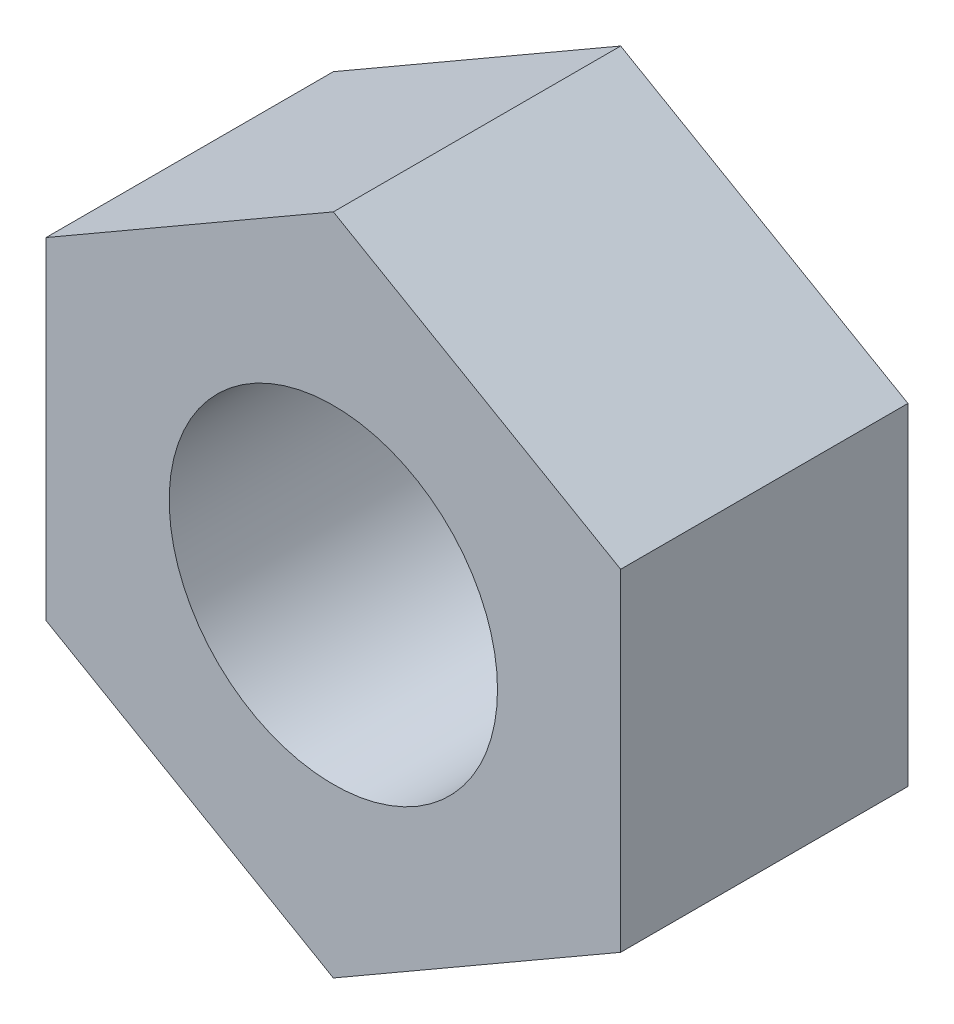
ISO-10303-21;
HEADER;
FILE_DESCRIPTION(('STEP AP214'),'2;1');
FILE_NAME('part.step','',(''),(''),'','','');
FILE_SCHEMA(('AUTOMOTIVE_DESIGN { 1 0 10303 214 1 1 1 1 }'));
ENDSEC;
DATA;
#1=APPLICATION_CONTEXT('core data for automotive mechanical design processes');
#2=APPLICATION_PROTOCOL_DEFINITION('international standard','automotive_design',2000,#1);
#3=PRODUCT_CONTEXT('',#1,'mechanical');
#4=PRODUCT('Part','Part','',(#3));
#5=PRODUCT_RELATED_PRODUCT_CATEGORY('part','',(#4));
#6=PRODUCT_DEFINITION_FORMATION('','',#4);
#7=PRODUCT_DEFINITION_CONTEXT('part definition',#1,'design');
#8=PRODUCT_DEFINITION('design','',#6,#7);
#9=PRODUCT_DEFINITION_SHAPE('','',#8);
#10=(LENGTH_UNIT() NAMED_UNIT(*) SI_UNIT(.MILLI.,.METRE.));
#11=(NAMED_UNIT(*) PLANE_ANGLE_UNIT() SI_UNIT($,.RADIAN.));
#12=(NAMED_UNIT(*) SI_UNIT($,.STERADIAN.) SOLID_ANGLE_UNIT());
#13=UNCERTAINTY_MEASURE_WITH_UNIT(LENGTH_MEASURE(1.E-05),#10,'distance_accuracy_value','');
#14=(GEOMETRIC_REPRESENTATION_CONTEXT(3) GLOBAL_UNCERTAINTY_ASSIGNED_CONTEXT((#13)) GLOBAL_UNIT_ASSIGNED_CONTEXT((#10,
#11,#12)) REPRESENTATION_CONTEXT('',''));
#15=CARTESIAN_POINT('',(0.,0.,0.));
#16=DIRECTION('',(0.,0.,1.));
#17=DIRECTION('',(1.,0.,0.));
#18=AXIS2_PLACEMENT_3D('',#15,#16,#17);
#19=CARTESIAN_POINT('',(-5.55625,3.20790243318486,2.778125));
#20=DIRECTION('',(0.,0.,1.));
#21=DIRECTION('',(1.,0.,0.));
#22=AXIS2_PLACEMENT_3D('',#19,#20,#21);
#23=PLANE('',#22);
#24=DIRECTION('',(-0.866025403784439,-0.5,0.));
#25=VECTOR('',#24,1.);
#26=CARTESIAN_POINT('',(0.,6.41580486636972,2.778125));
#27=LINE('',#26,#25);
#28=CARTESIAN_POINT('',(0.,6.41580486636972,2.778125));
#29=VERTEX_POINT('',#28);
#30=CARTESIAN_POINT('',(-5.55625,3.20790243318486,2.778125));
#31=VERTEX_POINT('',#30);
#32=EDGE_CURVE('E131',#29,#31,#27,.T.);
#33=ORIENTED_EDGE('',*,*,#32,.T.);
#34=DIRECTION('',(0.,-1.,0.));
#35=VECTOR('',#34,1.);
#36=CARTESIAN_POINT('',(-5.55625,3.20790243318486,2.778125));
#37=LINE('',#36,#35);
#38=CARTESIAN_POINT('',(-5.55625,-3.20790243318485,2.778125));
#39=VERTEX_POINT('',#38);
#40=EDGE_CURVE('E89',#31,#39,#37,.T.);
#41=ORIENTED_EDGE('',*,*,#40,.T.);
#42=DIRECTION('',(0.866025403784439,-0.5,0.));
#43=VECTOR('',#42,1.);
#44=CARTESIAN_POINT('',(-5.55625,-3.20790243318485,2.778125));
#45=LINE('',#44,#43);
#46=CARTESIAN_POINT('',(0.,-6.41580486636971,2.778125));
#47=VERTEX_POINT('',#46);
#48=EDGE_CURVE('E102',#39,#47,#45,.T.);
#49=ORIENTED_EDGE('',*,*,#48,.T.);
#50=DIRECTION('',(0.866025403784438,0.5,0.));
#51=VECTOR('',#50,1.);
#52=CARTESIAN_POINT('',(0.,-6.41580486636971,2.778125));
#53=LINE('',#52,#51);
#54=CARTESIAN_POINT('',(5.55624999999999,-3.20790243318485,2.778125));
#55=VERTEX_POINT('',#54);
#56=EDGE_CURVE('E96',#47,#55,#53,.T.);
#57=ORIENTED_EDGE('',*,*,#56,.T.);
#58=DIRECTION('',(0.,1.,0.));
#59=VECTOR('',#58,1.);
#60=CARTESIAN_POINT('',(5.55624999999999,-3.20790243318485,2.778125));
#61=LINE('',#60,#59);
#62=CARTESIAN_POINT('',(5.55624999999998,3.20790243318487,2.778125));
#63=VERTEX_POINT('',#62);
#64=EDGE_CURVE('E100',#55,#63,#61,.T.);
#65=ORIENTED_EDGE('',*,*,#64,.T.);
#66=DIRECTION('',(-0.866025403784439,0.5,0.));
#67=VECTOR('',#66,1.);
#68=CARTESIAN_POINT('',(5.55624999999998,3.20790243318487,2.778125));
#69=LINE('',#68,#67);
#70=EDGE_CURVE('E52',#63,#29,#69,.T.);
#71=ORIENTED_EDGE('',*,*,#70,.T.);
#72=EDGE_LOOP('',(#33,#41,#49,#57,#65,#71));
#73=FACE_BOUND('',#72,.T.);
#74=CARTESIAN_POINT('',(0.,0.,2.778125));
#75=DIRECTION('',(0.,0.,1.));
#76=DIRECTION('',(1.,0.,0.));
#77=AXIS2_PLACEMENT_3D('',#74,#75,#76);
#78=CIRCLE('',#77,3.175);
#79=CARTESIAN_POINT('',(3.175,0.,2.778125));
#80=VERTEX_POINT('',#79);
#81=EDGE_CURVE('E124',#80,#80,#78,.T.);
#82=ORIENTED_EDGE('',*,*,#81,.F.);
#83=EDGE_LOOP('',(#82));
#84=FACE_BOUND('',#83,.T.);
#85=ADVANCED_FACE('F35',(#73,#84),#23,.T.);
#86=CARTESIAN_POINT('',(-5.55625,3.20790243318486,-2.778125));
#87=DIRECTION('',(0.,0.,1.));
#88=DIRECTION('',(1.,0.,0.));
#89=AXIS2_PLACEMENT_3D('',#86,#87,#88);
#90=PLANE('',#89);
#91=DIRECTION('',(-0.866025403784439,-0.5,0.));
#92=VECTOR('',#91,1.);
#93=CARTESIAN_POINT('',(0.,6.41580486636972,-2.778125));
#94=LINE('',#93,#92);
#95=CARTESIAN_POINT('',(0.,6.41580486636972,-2.778125));
#96=VERTEX_POINT('',#95);
#97=CARTESIAN_POINT('',(-5.55625,3.20790243318486,-2.778125));
#98=VERTEX_POINT('',#97);
#99=EDGE_CURVE('E120',#96,#98,#94,.T.);
#100=ORIENTED_EDGE('',*,*,#99,.F.);
#101=DIRECTION('',(-0.866025403784439,0.5,0.));
#102=VECTOR('',#101,1.);
#103=CARTESIAN_POINT('',(5.55624999999998,3.20790243318487,-2.778125));
#104=LINE('',#103,#102);
#105=CARTESIAN_POINT('',(5.55624999999998,3.20790243318487,-2.778125));
#106=VERTEX_POINT('',#105);
#107=EDGE_CURVE('E81',#106,#96,#104,.T.);
#108=ORIENTED_EDGE('',*,*,#107,.F.);
#109=DIRECTION('',(0.,1.,0.));
#110=VECTOR('',#109,1.);
#111=CARTESIAN_POINT('',(5.55624999999999,-3.20790243318485,-2.778125));
#112=LINE('',#111,#110);
#113=CARTESIAN_POINT('',(5.55624999999999,-3.20790243318485,-2.778125));
#114=VERTEX_POINT('',#113);
#115=EDGE_CURVE('E75',#114,#106,#112,.T.);
#116=ORIENTED_EDGE('',*,*,#115,.F.);
#117=DIRECTION('',(0.866025403784438,0.5,0.));
#118=VECTOR('',#117,1.);
#119=CARTESIAN_POINT('',(0.,-6.41580486636971,-2.778125));
#120=LINE('',#119,#118);
#121=CARTESIAN_POINT('',(0.,-6.41580486636971,-2.778125));
#122=VERTEX_POINT('',#121);
#123=EDGE_CURVE('E110',#122,#114,#120,.T.);
#124=ORIENTED_EDGE('',*,*,#123,.F.);
#125=DIRECTION('',(0.866025403784439,-0.5,0.));
#126=VECTOR('',#125,1.);
#127=CARTESIAN_POINT('',(-5.55625,-3.20790243318485,-2.778125));
#128=LINE('',#127,#126);
#129=CARTESIAN_POINT('',(-5.55625,-3.20790243318485,-2.778125));
#130=VERTEX_POINT('',#129);
#131=EDGE_CURVE('E126',#130,#122,#128,.T.);
#132=ORIENTED_EDGE('',*,*,#131,.F.);
#133=DIRECTION('',(0.,-1.,0.));
#134=VECTOR('',#133,1.);
#135=CARTESIAN_POINT('',(-5.55625,3.20790243318486,-2.778125));
#136=LINE('',#135,#134);
#137=EDGE_CURVE('E123',#98,#130,#136,.T.);
#138=ORIENTED_EDGE('',*,*,#137,.F.);
#139=EDGE_LOOP('',(#100,#108,#116,#124,#132,#138));
#140=FACE_BOUND('',#139,.T.);
#141=CARTESIAN_POINT('',(0.,0.,-2.778125));
#142=DIRECTION('',(0.,0.,1.));
#143=DIRECTION('',(1.,0.,0.));
#144=AXIS2_PLACEMENT_3D('',#141,#142,#143);
#145=CIRCLE('',#144,3.175);
#146=CARTESIAN_POINT('',(3.175,0.,-2.778125));
#147=VERTEX_POINT('',#146);
#148=EDGE_CURVE('E224',#147,#147,#145,.T.);
#149=ORIENTED_EDGE('',*,*,#148,.T.);
#150=EDGE_LOOP('',(#149));
#151=FACE_BOUND('',#150,.T.);
#152=ADVANCED_FACE('F140',(#140,#151),#90,.F.);
#153=CARTESIAN_POINT('',(0.,6.41580486636972,2.778125));
#154=DIRECTION('',(0.5,-0.866025403784439,0.));
#155=DIRECTION('',(0.866025403784439,0.5,0.));
#156=AXIS2_PLACEMENT_3D('',#153,#154,#155);
#157=PLANE('',#156);
#158=ORIENTED_EDGE('',*,*,#99,.T.);
#159=DIRECTION('',(0.,0.,-1.));
#160=VECTOR('',#159,1.);
#161=CARTESIAN_POINT('',(-5.55625,3.20790243318486,2.778125));
#162=LINE('',#161,#160);
#163=EDGE_CURVE('E11',#31,#98,#162,.T.);
#164=ORIENTED_EDGE('',*,*,#163,.F.);
#165=ORIENTED_EDGE('',*,*,#32,.F.);
#166=DIRECTION('',(0.,0.,-1.));
#167=VECTOR('',#166,1.);
#168=CARTESIAN_POINT('',(0.,6.41580486636972,2.778125));
#169=LINE('',#168,#167);
#170=EDGE_CURVE('E116',#29,#96,#169,.T.);
#171=ORIENTED_EDGE('',*,*,#170,.T.);
#172=EDGE_LOOP('',(#158,#164,#165,#171));
#173=FACE_BOUND('',#172,.T.);
#174=ADVANCED_FACE('F37',(#173),#157,.F.);
#175=CARTESIAN_POINT('',(-5.55625,3.20790243318486,2.778125));
#176=DIRECTION('',(1.,0.,0.));
#177=DIRECTION('',(0.,1.,0.));
#178=AXIS2_PLACEMENT_3D('',#175,#176,#177);
#179=PLANE('',#178);
#180=ORIENTED_EDGE('',*,*,#137,.T.);
#181=DIRECTION('',(0.,0.,-1.));
#182=VECTOR('',#181,1.);
#183=CARTESIAN_POINT('',(-5.55625,-3.20790243318485,2.778125));
#184=LINE('',#183,#182);
#185=EDGE_CURVE('E44',#39,#130,#184,.T.);
#186=ORIENTED_EDGE('',*,*,#185,.F.);
#187=ORIENTED_EDGE('',*,*,#40,.F.);
#188=ORIENTED_EDGE('',*,*,#163,.T.);
#189=EDGE_LOOP('',(#180,#186,#187,#188));
#190=FACE_BOUND('',#189,.T.);
#191=ADVANCED_FACE('F165',(#190),#179,.F.);
#192=CARTESIAN_POINT('',(-5.55625,-3.20790243318485,2.778125));
#193=DIRECTION('',(0.5,0.866025403784439,0.));
#194=DIRECTION('',(-0.866025403784439,0.5,0.));
#195=AXIS2_PLACEMENT_3D('',#192,#193,#194);
#196=PLANE('',#195);
#197=ORIENTED_EDGE('',*,*,#131,.T.);
#198=DIRECTION('',(0.,0.,-1.));
#199=VECTOR('',#198,1.);
#200=CARTESIAN_POINT('',(0.,-6.41580486636971,2.778125));
#201=LINE('',#200,#199);
#202=EDGE_CURVE('E111',#47,#122,#201,.T.);
#203=ORIENTED_EDGE('',*,*,#202,.F.);
#204=ORIENTED_EDGE('',*,*,#48,.F.);
#205=ORIENTED_EDGE('',*,*,#185,.T.);
#206=EDGE_LOOP('',(#197,#203,#204,#205));
#207=FACE_BOUND('',#206,.T.);
#208=ADVANCED_FACE('F137',(#207),#196,.F.);
#209=CARTESIAN_POINT('',(0.,-6.41580486636971,2.778125));
#210=DIRECTION('',(-0.5,0.866025403784438,0.));
#211=DIRECTION('',(-0.866025403784439,-0.5,0.));
#212=AXIS2_PLACEMENT_3D('',#209,#210,#211);
#213=PLANE('',#212);
#214=ORIENTED_EDGE('',*,*,#123,.T.);
#215=DIRECTION('',(0.,0.,-1.));
#216=VECTOR('',#215,1.);
#217=CARTESIAN_POINT('',(5.55624999999999,-3.20790243318485,2.778125));
#218=LINE('',#217,#216);
#219=EDGE_CURVE('E107',#55,#114,#218,.T.);
#220=ORIENTED_EDGE('',*,*,#219,.F.);
#221=ORIENTED_EDGE('',*,*,#56,.F.);
#222=ORIENTED_EDGE('',*,*,#202,.T.);
#223=EDGE_LOOP('',(#214,#220,#221,#222));
#224=FACE_BOUND('',#223,.T.);
#225=ADVANCED_FACE('F108',(#224),#213,.F.);
#226=CARTESIAN_POINT('',(5.55624999999999,-3.20790243318485,2.778125));
#227=DIRECTION('',(-1.,0.,0.));
#228=DIRECTION('',(0.,-1.,0.));
#229=AXIS2_PLACEMENT_3D('',#226,#227,#228);
#230=PLANE('',#229);
#231=ORIENTED_EDGE('',*,*,#115,.T.);
#232=DIRECTION('',(0.,0.,-1.));
#233=VECTOR('',#232,1.);
#234=CARTESIAN_POINT('',(5.55624999999998,3.20790243318487,2.778125));
#235=LINE('',#234,#233);
#236=EDGE_CURVE('E112',#63,#106,#235,.T.);
#237=ORIENTED_EDGE('',*,*,#236,.F.);
#238=ORIENTED_EDGE('',*,*,#64,.F.);
#239=ORIENTED_EDGE('',*,*,#219,.T.);
#240=EDGE_LOOP('',(#231,#237,#238,#239));
#241=FACE_BOUND('',#240,.T.);
#242=ADVANCED_FACE('F114',(#241),#230,.F.);
#243=CARTESIAN_POINT('',(5.55624999999998,3.20790243318487,2.778125));
#244=DIRECTION('',(-0.5,-0.866025403784439,0.));
#245=DIRECTION('',(0.866025403784439,-0.5,0.));
#246=AXIS2_PLACEMENT_3D('',#243,#244,#245);
#247=PLANE('',#246);
#248=ORIENTED_EDGE('',*,*,#107,.T.);
#249=ORIENTED_EDGE('',*,*,#170,.F.);
#250=ORIENTED_EDGE('',*,*,#70,.F.);
#251=ORIENTED_EDGE('',*,*,#236,.T.);
#252=EDGE_LOOP('',(#248,#249,#250,#251));
#253=FACE_BOUND('',#252,.T.);
#254=ADVANCED_FACE('F145',(#253),#247,.F.);
#255=CARTESIAN_POINT('',(0.,0.,2.778125));
#256=DIRECTION('',(0.,0.,-1.));
#257=DIRECTION('',(-1.,0.,0.));
#258=AXIS2_PLACEMENT_3D('',#255,#256,#257);
#259=CYLINDRICAL_SURFACE('',#258,3.175);
#260=ORIENTED_EDGE('',*,*,#81,.T.);
#261=EDGE_LOOP('',(#260));
#262=FACE_BOUND('',#261,.T.);
#263=ORIENTED_EDGE('',*,*,#148,.F.);
#264=EDGE_LOOP('',(#263));
#265=FACE_BOUND('',#264,.T.);
#266=ADVANCED_FACE('F147',(#262,#265),#259,.F.);
#267=CLOSED_SHELL('',(#85,#152,#174,#191,#208,#225,#242,#254,#266));
#268=MANIFOLD_SOLID_BREP('B2',#267);
#269=ADVANCED_BREP_SHAPE_REPRESENTATION('',(#18,#268),#14);
#270=SHAPE_DEFINITION_REPRESENTATION(#9,#269);
ENDSEC;
END-ISO-10303-21;
